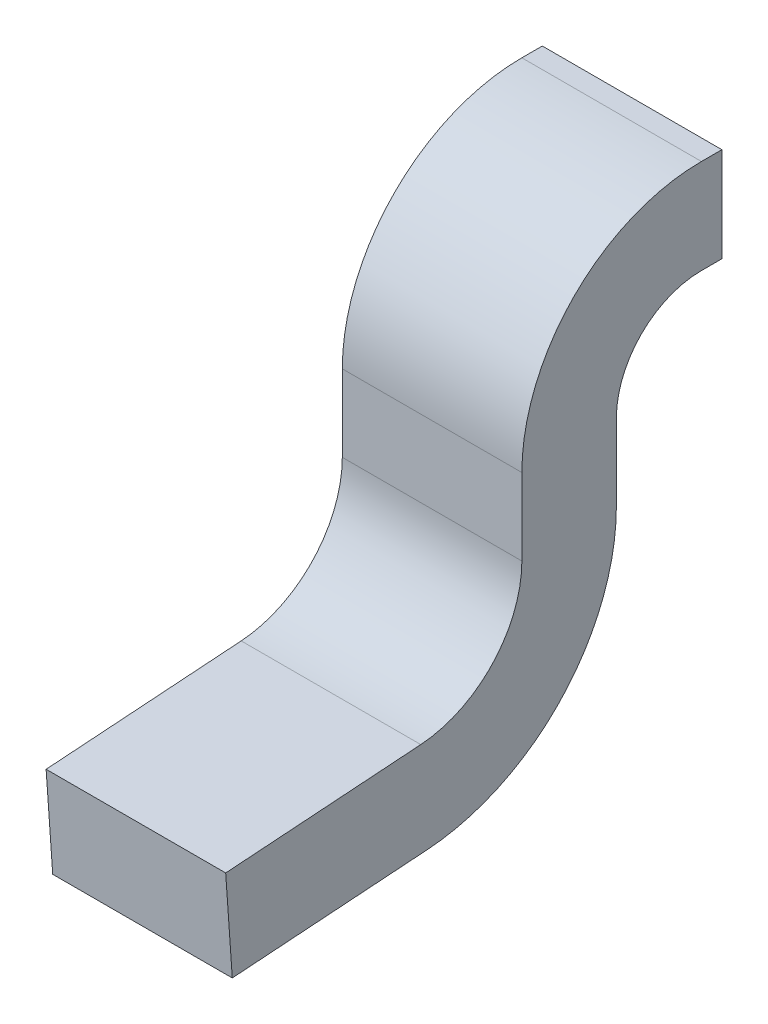
ISO-10303-21;
HEADER;
FILE_DESCRIPTION(('STEP AP214'),'2;1');
FILE_NAME('part.step','',(''),(''),'','','');
FILE_SCHEMA(('AUTOMOTIVE_DESIGN { 1 0 10303 214 1 1 1 1 }'));
ENDSEC;
DATA;
#1=APPLICATION_CONTEXT('core data for automotive mechanical design processes');
#2=APPLICATION_PROTOCOL_DEFINITION('international standard','automotive_design',2000,#1);
#3=PRODUCT_CONTEXT('',#1,'mechanical');
#4=PRODUCT('Part','Part','',(#3));
#5=PRODUCT_RELATED_PRODUCT_CATEGORY('part','',(#4));
#6=PRODUCT_DEFINITION_FORMATION('','',#4);
#7=PRODUCT_DEFINITION_CONTEXT('part definition',#1,'design');
#8=PRODUCT_DEFINITION('design','',#6,#7);
#9=PRODUCT_DEFINITION_SHAPE('','',#8);
#10=(LENGTH_UNIT() NAMED_UNIT(*) SI_UNIT(.MILLI.,.METRE.));
#11=(NAMED_UNIT(*) PLANE_ANGLE_UNIT() SI_UNIT($,.RADIAN.));
#12=(NAMED_UNIT(*) SI_UNIT($,.STERADIAN.) SOLID_ANGLE_UNIT());
#13=UNCERTAINTY_MEASURE_WITH_UNIT(LENGTH_MEASURE(1.E-05),#10,'distance_accuracy_value','');
#14=(GEOMETRIC_REPRESENTATION_CONTEXT(3) GLOBAL_UNCERTAINTY_ASSIGNED_CONTEXT((#13)) GLOBAL_UNIT_ASSIGNED_CONTEXT((#10,
#11,#12)) REPRESENTATION_CONTEXT('',''));
#15=CARTESIAN_POINT('',(0.,0.,0.));
#16=DIRECTION('',(0.,0.,1.));
#17=DIRECTION('',(1.,0.,0.));
#18=AXIS2_PLACEMENT_3D('',#15,#16,#17);
#19=CARTESIAN_POINT('',(-0.19,0.207817999787,0.43));
#20=DIRECTION('',(-1.,0.,0.));
#21=DIRECTION('',(0.,0.,-1.));
#22=AXIS2_PLACEMENT_3D('',#19,#20,#21);
#23=CYLINDRICAL_SURFACE('',#22,0.43);
#24=CARTESIAN_POINT('',(0.19,0.207817999787,0.43));
#25=DIRECTION('',(-1.,0.,0.));
#26=DIRECTION('',(0.,0.,-1.));
#27=AXIS2_PLACEMENT_3D('',#24,#25,#26);
#28=CIRCLE('',#27,0.43);
#29=CARTESIAN_POINT('',(0.19,0.207817999787,0.));
#30=VERTEX_POINT('',#29);
#31=CARTESIAN_POINT('',(0.19,-0.221134541825,0.40000471629));
#32=VERTEX_POINT('',#31);
#33=EDGE_CURVE('E201',#30,#32,#28,.T.);
#34=ORIENTED_EDGE('',*,*,#33,.T.);
#35=DIRECTION('',(1.,0.,0.));
#36=VECTOR('',#35,1.);
#37=CARTESIAN_POINT('',(-0.19,-0.221134541825,0.40000471629));
#38=LINE('',#37,#36);
#39=CARTESIAN_POINT('',(-0.19,-0.221134541825,0.40000471629));
#40=VERTEX_POINT('',#39);
#41=EDGE_CURVE('E11',#40,#32,#38,.T.);
#42=ORIENTED_EDGE('',*,*,#41,.F.);
#43=CARTESIAN_POINT('',(-0.19,0.207817999787,0.43));
#44=DIRECTION('',(1.,0.,0.));
#45=DIRECTION('',(0.,-0.997564050259862,-0.0697564737435804));
#46=AXIS2_PLACEMENT_3D('',#43,#44,#45);
#47=CIRCLE('',#46,0.43);
#48=CARTESIAN_POINT('',(-0.19,0.207817999787,0.));
#49=VERTEX_POINT('',#48);
#50=EDGE_CURVE('E254',#40,#49,#47,.T.);
#51=ORIENTED_EDGE('',*,*,#50,.T.);
#52=DIRECTION('',(-1.,0.,0.));
#53=VECTOR('',#52,1.);
#54=CARTESIAN_POINT('',(0.19,0.207817999787,0.));
#55=LINE('',#54,#53);
#56=EDGE_CURVE('E173',#30,#49,#55,.T.);
#57=ORIENTED_EDGE('',*,*,#56,.F.);
#58=EDGE_LOOP('',(#34,#42,#51,#57));
#59=FACE_BOUND('',#58,.T.);
#60=ADVANCED_FACE('F17',(#59),#23,.T.);
#61=CARTESIAN_POINT('',(-0.19,-0.25,0.8128));
#62=DIRECTION('',(0.,-0.997564050259825,-0.0697564737441177));
#63=DIRECTION('',(0.,0.0697564737441177,-0.997564050259825));
#64=AXIS2_PLACEMENT_3D('',#61,#62,#63);
#65=PLANE('',#64);
#66=ORIENTED_EDGE('',*,*,#41,.T.);
#67=DIRECTION('',(0.,-0.0697564737441377,0.997564050259823));
#68=VECTOR('',#67,1.);
#69=CARTESIAN_POINT('',(0.19,-0.221134541825,0.40000471629));
#70=LINE('',#69,#68);
#71=CARTESIAN_POINT('',(0.19,-0.25,0.8128));
#72=VERTEX_POINT('',#71);
#73=EDGE_CURVE('E193',#32,#72,#70,.T.);
#74=ORIENTED_EDGE('',*,*,#73,.T.);
#75=DIRECTION('',(-1.,0.,0.));
#76=VECTOR('',#75,1.);
#77=CARTESIAN_POINT('',(0.19,-0.25,0.8128));
#78=LINE('',#77,#76);
#79=CARTESIAN_POINT('',(-0.19,-0.25,0.8128));
#80=VERTEX_POINT('',#79);
#81=EDGE_CURVE('E26',#72,#80,#78,.T.);
#82=ORIENTED_EDGE('',*,*,#81,.T.);
#83=DIRECTION('',(0.,0.0697564737441377,-0.997564050259823));
#84=VECTOR('',#83,1.);
#85=CARTESIAN_POINT('',(-0.19,-0.25,0.8128));
#86=LINE('',#85,#84);
#87=EDGE_CURVE('E241',#80,#40,#86,.T.);
#88=ORIENTED_EDGE('',*,*,#87,.T.);
#89=EDGE_LOOP('',(#66,#74,#82,#88));
#90=FACE_BOUND('',#89,.T.);
#91=ADVANCED_FACE('F239',(#90),#65,.T.);
#92=CARTESIAN_POINT('',(-0.19,-0.05048718994804,0.826751294749));
#93=DIRECTION('',(0.,-0.0697564737441177,0.997564050259825));
#94=DIRECTION('',(-1.,0.,0.));
#95=AXIS2_PLACEMENT_3D('',#92,#93,#94);
#96=PLANE('',#95);
#97=ORIENTED_EDGE('',*,*,#81,.F.);
#98=DIRECTION('',(0.,0.997564050259828,0.069756473744078));
#99=VECTOR('',#98,1.);
#100=CARTESIAN_POINT('',(0.19,-0.25,0.8128));
#101=LINE('',#100,#99);
#102=CARTESIAN_POINT('',(0.19,-0.05048718994804,0.826751294749));
#103=VERTEX_POINT('',#102);
#104=EDGE_CURVE('E189',#72,#103,#101,.T.);
#105=ORIENTED_EDGE('',*,*,#104,.T.);
#106=DIRECTION('',(-1.,0.,0.));
#107=VECTOR('',#106,1.);
#108=CARTESIAN_POINT('',(0.19,-0.05048718994804,0.826751294749));
#109=LINE('',#108,#107);
#110=CARTESIAN_POINT('',(-0.19,-0.05048718994804,0.826751294749));
#111=VERTEX_POINT('',#110);
#112=EDGE_CURVE('E232',#103,#111,#109,.T.);
#113=ORIENTED_EDGE('',*,*,#112,.T.);
#114=DIRECTION('',(0.,-0.997564050259828,-0.069756473744078));
#115=VECTOR('',#114,1.);
#116=CARTESIAN_POINT('',(-0.19,-0.05048718994804,0.826751294749));
#117=LINE('',#116,#115);
#118=EDGE_CURVE('E246',#111,#80,#117,.T.);
#119=ORIENTED_EDGE('',*,*,#118,.T.);
#120=EDGE_LOOP('',(#97,#105,#113,#119));
#121=FACE_BOUND('',#120,.T.);
#122=ADVANCED_FACE('F19',(#121),#96,.T.);
#123=CARTESIAN_POINT('',(-0.19,-0.006660470024782,0.2));
#124=DIRECTION('',(0.,0.997564050259825,0.0697564737441177));
#125=DIRECTION('',(1.,0.,0.));
#126=AXIS2_PLACEMENT_3D('',#123,#124,#125);
#127=PLANE('',#126);
#128=ORIENTED_EDGE('',*,*,#112,.F.);
#129=DIRECTION('',(0.,0.0697564737441377,-0.997564050259823));
#130=VECTOR('',#129,1.);
#131=CARTESIAN_POINT('',(0.19,-0.05048718994804,0.826751294749));
#132=LINE('',#131,#130);
#133=CARTESIAN_POINT('',(0.19,-0.02162173177288,0.413956011039));
#134=VERTEX_POINT('',#133);
#135=EDGE_CURVE('E188',#103,#134,#132,.T.);
#136=ORIENTED_EDGE('',*,*,#135,.T.);
#137=DIRECTION('',(-1.,0.,0.));
#138=VECTOR('',#137,1.);
#139=CARTESIAN_POINT('',(0.19,-0.02162173177288,0.413956011039));
#140=LINE('',#139,#138);
#141=CARTESIAN_POINT('',(-0.19,-0.02162173177287,0.413956011039));
#142=VERTEX_POINT('',#141);
#143=EDGE_CURVE('E229',#134,#142,#140,.T.);
#144=ORIENTED_EDGE('',*,*,#143,.T.);
#145=DIRECTION('',(0.,-0.0697564737441377,0.997564050259823));
#146=VECTOR('',#145,1.);
#147=CARTESIAN_POINT('',(-0.19,-0.02162173177288,0.413956011039));
#148=LINE('',#147,#146);
#149=EDGE_CURVE('E250',#142,#111,#148,.T.);
#150=ORIENTED_EDGE('',*,*,#149,.T.);
#151=EDGE_LOOP('',(#128,#136,#144,#150));
#152=FACE_BOUND('',#151,.T.);
#153=ADVANCED_FACE('F334',(#152),#127,.T.);
#154=CARTESIAN_POINT('',(-0.19,0.207817999787,0.43));
#155=DIRECTION('',(1.,0.,0.));
#156=DIRECTION('',(0.,-0.997564050259825,-0.0697564737441178));
#157=AXIS2_PLACEMENT_3D('',#154,#155,#156);
#158=CYLINDRICAL_SURFACE('',#157,0.23);
#159=CARTESIAN_POINT('',(0.19,0.207817999787,0.43));
#160=DIRECTION('',(1.,0.,0.));
#161=DIRECTION('',(0.,-0.997564050259886,-0.069756473743242));
#162=AXIS2_PLACEMENT_3D('',#159,#160,#161);
#163=CIRCLE('',#162,0.23);
#164=CARTESIAN_POINT('',(0.19,0.207817999787,0.2));
#165=VERTEX_POINT('',#164);
#166=EDGE_CURVE('E184',#134,#165,#163,.T.);
#167=ORIENTED_EDGE('',*,*,#166,.T.);
#168=DIRECTION('',(1.,0.,0.));
#169=VECTOR('',#168,1.);
#170=CARTESIAN_POINT('',(-0.19,0.207817999787,0.2));
#171=LINE('',#170,#169);
#172=CARTESIAN_POINT('',(-0.19,0.207817999787,0.2));
#173=VERTEX_POINT('',#172);
#174=EDGE_CURVE('E218',#173,#165,#171,.T.);
#175=ORIENTED_EDGE('',*,*,#174,.F.);
#176=CARTESIAN_POINT('',(-0.19,0.207817999787,0.43));
#177=DIRECTION('',(-1.,0.,0.));
#178=DIRECTION('',(0.,0.,-1.));
#179=AXIS2_PLACEMENT_3D('',#176,#177,#178);
#180=CIRCLE('',#179,0.23);
#181=EDGE_CURVE('E268',#173,#142,#180,.T.);
#182=ORIENTED_EDGE('',*,*,#181,.T.);
#183=ORIENTED_EDGE('',*,*,#143,.F.);
#184=EDGE_LOOP('',(#167,#175,#182,#183));
#185=FACE_BOUND('',#184,.T.);
#186=ADVANCED_FACE('F286',(#185),#158,.F.);
#187=CARTESIAN_POINT('',(-0.19,0.37,-0.18));
#188=DIRECTION('',(1.,0.,0.));
#189=DIRECTION('',(0.,1.,0.));
#190=AXIS2_PLACEMENT_3D('',#187,#188,#189);
#191=CYLINDRICAL_SURFACE('',#190,0.18);
#192=CARTESIAN_POINT('',(0.19,0.37,-0.18));
#193=DIRECTION('',(1.,0.,0.));
#194=DIRECTION('',(0.,1.,0.));
#195=AXIS2_PLACEMENT_3D('',#192,#193,#194);
#196=CIRCLE('',#195,0.18);
#197=CARTESIAN_POINT('',(0.19,0.55,-0.18));
#198=VERTEX_POINT('',#197);
#199=CARTESIAN_POINT('',(0.19,0.37,0.));
#200=VERTEX_POINT('',#199);
#201=EDGE_CURVE('E197',#198,#200,#196,.T.);
#202=ORIENTED_EDGE('',*,*,#201,.T.);
#203=DIRECTION('',(1.,0.,0.));
#204=VECTOR('',#203,1.);
#205=CARTESIAN_POINT('',(-0.19,0.37,0.));
#206=LINE('',#205,#204);
#207=CARTESIAN_POINT('',(-0.19,0.37,0.));
#208=VERTEX_POINT('',#207);
#209=EDGE_CURVE('E179',#208,#200,#206,.T.);
#210=ORIENTED_EDGE('',*,*,#209,.F.);
#211=CARTESIAN_POINT('',(-0.19,0.37,-0.18));
#212=DIRECTION('',(-1.,0.,0.));
#213=DIRECTION('',(0.,0.,1.));
#214=AXIS2_PLACEMENT_3D('',#211,#212,#213);
#215=CIRCLE('',#214,0.18);
#216=CARTESIAN_POINT('',(-0.19,0.55,-0.18));
#217=VERTEX_POINT('',#216);
#218=EDGE_CURVE('E159',#208,#217,#215,.T.);
#219=ORIENTED_EDGE('',*,*,#218,.T.);
#220=DIRECTION('',(-1.,0.,0.));
#221=VECTOR('',#220,1.);
#222=CARTESIAN_POINT('',(0.19,0.55,-0.18));
#223=LINE('',#222,#221);
#224=EDGE_CURVE('E149',#198,#217,#223,.T.);
#225=ORIENTED_EDGE('',*,*,#224,.F.);
#226=EDGE_LOOP('',(#202,#210,#219,#225));
#227=FACE_BOUND('',#226,.T.);
#228=ADVANCED_FACE('F299',(#227),#191,.F.);
#229=CARTESIAN_POINT('',(-0.19,0.55,0.));
#230=DIRECTION('',(0.,-1.,0.));
#231=DIRECTION('',(0.,0.,-1.));
#232=AXIS2_PLACEMENT_3D('',#229,#230,#231);
#233=PLANE('',#232);
#234=DIRECTION('',(-1.,0.,0.));
#235=VECTOR('',#234,1.);
#236=CARTESIAN_POINT('',(0.19,0.55,-0.223248705251));
#237=LINE('',#236,#235);
#238=CARTESIAN_POINT('',(0.19,0.55,-0.223248705251));
#239=VERTEX_POINT('',#238);
#240=CARTESIAN_POINT('',(-0.19,0.55,-0.223248705251));
#241=VERTEX_POINT('',#240);
#242=EDGE_CURVE('E137',#239,#241,#237,.T.);
#243=ORIENTED_EDGE('',*,*,#242,.F.);
#244=DIRECTION('',(0.,0.,1.));
#245=VECTOR('',#244,1.);
#246=CARTESIAN_POINT('',(0.19,0.55,-0.223248705251));
#247=LINE('',#246,#245);
#248=EDGE_CURVE('E194',#239,#198,#247,.T.);
#249=ORIENTED_EDGE('',*,*,#248,.T.);
#250=ORIENTED_EDGE('',*,*,#224,.T.);
#251=DIRECTION('',(0.,0.,1.));
#252=VECTOR('',#251,1.);
#253=CARTESIAN_POINT('',(-0.19,0.55,-0.223248705251));
#254=LINE('',#253,#252);
#255=EDGE_CURVE('E153',#241,#217,#254,.T.);
#256=ORIENTED_EDGE('',*,*,#255,.F.);
#257=EDGE_LOOP('',(#243,#249,#250,#256));
#258=FACE_BOUND('',#257,.T.);
#259=ADVANCED_FACE('F154',(#258),#233,.T.);
#260=CARTESIAN_POINT('',(-0.19,0.55,-0.223248705251));
#261=DIRECTION('',(0.,0.,-1.));
#262=DIRECTION('',(0.,-1.,0.));
#263=AXIS2_PLACEMENT_3D('',#260,#261,#262);
#264=PLANE('',#263);
#265=DIRECTION('',(-1.,0.,0.));
#266=VECTOR('',#265,1.);
#267=CARTESIAN_POINT('',(0.19,0.75,-0.223248705251));
#268=LINE('',#267,#266);
#269=CARTESIAN_POINT('',(0.19,0.75,-0.223248705251));
#270=VERTEX_POINT('',#269);
#271=CARTESIAN_POINT('',(-0.19,0.75,-0.223248705251));
#272=VERTEX_POINT('',#271);
#273=EDGE_CURVE('E150',#270,#272,#268,.T.);
#274=ORIENTED_EDGE('',*,*,#273,.F.);
#275=DIRECTION('',(0.,-1.,0.));
#276=VECTOR('',#275,1.);
#277=CARTESIAN_POINT('',(0.19,0.75,-0.223248705251));
#278=LINE('',#277,#276);
#279=EDGE_CURVE('E144',#270,#239,#278,.T.);
#280=ORIENTED_EDGE('',*,*,#279,.T.);
#281=ORIENTED_EDGE('',*,*,#242,.T.);
#282=DIRECTION('',(0.,-1.,0.));
#283=VECTOR('',#282,1.);
#284=CARTESIAN_POINT('',(-0.19,0.75,-0.223248705251));
#285=LINE('',#284,#283);
#286=EDGE_CURVE('E141',#272,#241,#285,.T.);
#287=ORIENTED_EDGE('',*,*,#286,.F.);
#288=EDGE_LOOP('',(#274,#280,#281,#287));
#289=FACE_BOUND('',#288,.T.);
#290=ADVANCED_FACE('F139',(#289),#264,.T.);
#291=CARTESIAN_POINT('',(-0.19,0.75,-0.223248705251));
#292=DIRECTION('',(0.,1.,0.));
#293=DIRECTION('',(1.,0.,0.));
#294=AXIS2_PLACEMENT_3D('',#291,#292,#293);
#295=PLANE('',#294);
#296=DIRECTION('',(1.,0.,0.));
#297=VECTOR('',#296,1.);
#298=CARTESIAN_POINT('',(-0.19,0.75,-0.18));
#299=LINE('',#298,#297);
#300=CARTESIAN_POINT('',(-0.19,0.75,-0.18));
#301=VERTEX_POINT('',#300);
#302=CARTESIAN_POINT('',(0.19,0.75,-0.18));
#303=VERTEX_POINT('',#302);
#304=EDGE_CURVE('E48',#301,#303,#299,.T.);
#305=ORIENTED_EDGE('',*,*,#304,.T.);
#306=DIRECTION('',(0.,0.,-1.));
#307=VECTOR('',#306,1.);
#308=CARTESIAN_POINT('',(0.19,0.75,-0.18));
#309=LINE('',#308,#307);
#310=EDGE_CURVE('E209',#303,#270,#309,.T.);
#311=ORIENTED_EDGE('',*,*,#310,.T.);
#312=ORIENTED_EDGE('',*,*,#273,.T.);
#313=DIRECTION('',(0.,0.,-1.));
#314=VECTOR('',#313,1.);
#315=CARTESIAN_POINT('',(-0.19,0.75,-0.18));
#316=LINE('',#315,#314);
#317=EDGE_CURVE('E164',#301,#272,#316,.T.);
#318=ORIENTED_EDGE('',*,*,#317,.F.);
#319=EDGE_LOOP('',(#305,#311,#312,#318));
#320=FACE_BOUND('',#319,.T.);
#321=ADVANCED_FACE('F295',(#320),#295,.T.);
#322=CARTESIAN_POINT('',(-0.19,0.37,-0.18));
#323=DIRECTION('',(-1.,0.,0.));
#324=DIRECTION('',(0.,0.,1.));
#325=AXIS2_PLACEMENT_3D('',#322,#323,#324);
#326=CYLINDRICAL_SURFACE('',#325,0.38);
#327=CARTESIAN_POINT('',(0.19,0.37,-0.18));
#328=DIRECTION('',(-1.,0.,0.));
#329=DIRECTION('',(0.,0.,1.));
#330=AXIS2_PLACEMENT_3D('',#327,#328,#329);
#331=CIRCLE('',#330,0.38);
#332=CARTESIAN_POINT('',(0.19,0.37,0.2));
#333=VERTEX_POINT('',#332);
#334=EDGE_CURVE('E212',#333,#303,#331,.T.);
#335=ORIENTED_EDGE('',*,*,#334,.T.);
#336=ORIENTED_EDGE('',*,*,#304,.F.);
#337=CARTESIAN_POINT('',(-0.19,0.37,-0.18));
#338=DIRECTION('',(1.,0.,0.));
#339=DIRECTION('',(0.,1.,0.));
#340=AXIS2_PLACEMENT_3D('',#337,#338,#339);
#341=CIRCLE('',#340,0.38);
#342=CARTESIAN_POINT('',(-0.19,0.37,0.2));
#343=VERTEX_POINT('',#342);
#344=EDGE_CURVE('E170',#301,#343,#341,.T.);
#345=ORIENTED_EDGE('',*,*,#344,.T.);
#346=DIRECTION('',(-1.,0.,0.));
#347=VECTOR('',#346,1.);
#348=CARTESIAN_POINT('',(0.19,0.37,0.2));
#349=LINE('',#348,#347);
#350=EDGE_CURVE('E38',#333,#343,#349,.T.);
#351=ORIENTED_EDGE('',*,*,#350,.F.);
#352=EDGE_LOOP('',(#335,#336,#345,#351));
#353=FACE_BOUND('',#352,.T.);
#354=ADVANCED_FACE('F294',(#353),#326,.T.);
#355=CARTESIAN_POINT('',(-0.19,0.,0.2));
#356=DIRECTION('',(0.,0.,1.));
#357=DIRECTION('',(1.,0.,0.));
#358=AXIS2_PLACEMENT_3D('',#355,#356,#357);
#359=PLANE('',#358);
#360=ORIENTED_EDGE('',*,*,#174,.T.);
#361=DIRECTION('',(0.,1.,0.));
#362=VECTOR('',#361,1.);
#363=CARTESIAN_POINT('',(0.19,0.207817999787,0.2));
#364=LINE('',#363,#362);
#365=EDGE_CURVE('E215',#165,#333,#364,.T.);
#366=ORIENTED_EDGE('',*,*,#365,.T.);
#367=ORIENTED_EDGE('',*,*,#350,.T.);
#368=DIRECTION('',(0.,-1.,0.));
#369=VECTOR('',#368,1.);
#370=CARTESIAN_POINT('',(-0.19,0.37,0.2));
#371=LINE('',#370,#369);
#372=EDGE_CURVE('E272',#343,#173,#371,.T.);
#373=ORIENTED_EDGE('',*,*,#372,.T.);
#374=EDGE_LOOP('',(#360,#366,#367,#373));
#375=FACE_BOUND('',#374,.T.);
#376=ADVANCED_FACE('F283',(#375),#359,.T.);
#377=CARTESIAN_POINT('',(0.19,0.,0.));
#378=DIRECTION('',(1.,0.,0.));
#379=DIRECTION('',(0.,1.,0.));
#380=AXIS2_PLACEMENT_3D('',#377,#378,#379);
#381=PLANE('',#380);
#382=ORIENTED_EDGE('',*,*,#166,.F.);
#383=ORIENTED_EDGE('',*,*,#135,.F.);
#384=ORIENTED_EDGE('',*,*,#104,.F.);
#385=ORIENTED_EDGE('',*,*,#73,.F.);
#386=ORIENTED_EDGE('',*,*,#33,.F.);
#387=DIRECTION('',(0.,-1.,0.));
#388=VECTOR('',#387,1.);
#389=CARTESIAN_POINT('',(0.19,0.37,0.));
#390=LINE('',#389,#388);
#391=EDGE_CURVE('E183',#200,#30,#390,.T.);
#392=ORIENTED_EDGE('',*,*,#391,.F.);
#393=ORIENTED_EDGE('',*,*,#201,.F.);
#394=ORIENTED_EDGE('',*,*,#248,.F.);
#395=ORIENTED_EDGE('',*,*,#279,.F.);
#396=ORIENTED_EDGE('',*,*,#310,.F.);
#397=ORIENTED_EDGE('',*,*,#334,.F.);
#398=ORIENTED_EDGE('',*,*,#365,.F.);
#399=EDGE_LOOP('',(#382,#383,#384,#385,#386,#392,#393,#394,#395,#396,#397,#398));
#400=FACE_BOUND('',#399,.T.);
#401=ADVANCED_FACE('F291',(#400),#381,.T.);
#402=CARTESIAN_POINT('',(-0.19,-0.193163487252,0.));
#403=DIRECTION('',(0.,0.,-1.));
#404=DIRECTION('',(0.,-1.,0.));
#405=AXIS2_PLACEMENT_3D('',#402,#403,#404);
#406=PLANE('',#405);
#407=ORIENTED_EDGE('',*,*,#56,.T.);
#408=DIRECTION('',(0.,1.,0.));
#409=VECTOR('',#408,1.);
#410=CARTESIAN_POINT('',(-0.19,0.207817999787,0.));
#411=LINE('',#410,#409);
#412=EDGE_CURVE('E175',#49,#208,#411,.T.);
#413=ORIENTED_EDGE('',*,*,#412,.T.);
#414=ORIENTED_EDGE('',*,*,#209,.T.);
#415=ORIENTED_EDGE('',*,*,#391,.T.);
#416=EDGE_LOOP('',(#407,#413,#414,#415));
#417=FACE_BOUND('',#416,.T.);
#418=ADVANCED_FACE('F303',(#417),#406,.T.);
#419=CARTESIAN_POINT('',(-0.19,0.,0.));
#420=DIRECTION('',(1.,0.,0.));
#421=DIRECTION('',(0.,1.,0.));
#422=AXIS2_PLACEMENT_3D('',#419,#420,#421);
#423=PLANE('',#422);
#424=ORIENTED_EDGE('',*,*,#50,.F.);
#425=ORIENTED_EDGE('',*,*,#87,.F.);
#426=ORIENTED_EDGE('',*,*,#118,.F.);
#427=ORIENTED_EDGE('',*,*,#149,.F.);
#428=ORIENTED_EDGE('',*,*,#181,.F.);
#429=ORIENTED_EDGE('',*,*,#372,.F.);
#430=ORIENTED_EDGE('',*,*,#344,.F.);
#431=ORIENTED_EDGE('',*,*,#317,.T.);
#432=ORIENTED_EDGE('',*,*,#286,.T.);
#433=ORIENTED_EDGE('',*,*,#255,.T.);
#434=ORIENTED_EDGE('',*,*,#218,.F.);
#435=ORIENTED_EDGE('',*,*,#412,.F.);
#436=EDGE_LOOP('',(#424,#425,#426,#427,#428,#429,#430,#431,#432,#433,#434,#435));
#437=FACE_BOUND('',#436,.T.);
#438=ADVANCED_FACE('F162',(#437),#423,.F.);
#439=CLOSED_SHELL('',(#60,#91,#122,#153,#186,#228,#259,#290,#321,#354,#376,#401,#418,#438));
#440=MANIFOLD_SOLID_BREP('B1',#439);
#441=ADVANCED_BREP_SHAPE_REPRESENTATION('',(#18,#440),#14);
#442=SHAPE_DEFINITION_REPRESENTATION(#9,#441);
ENDSEC;
END-ISO-10303-21;
